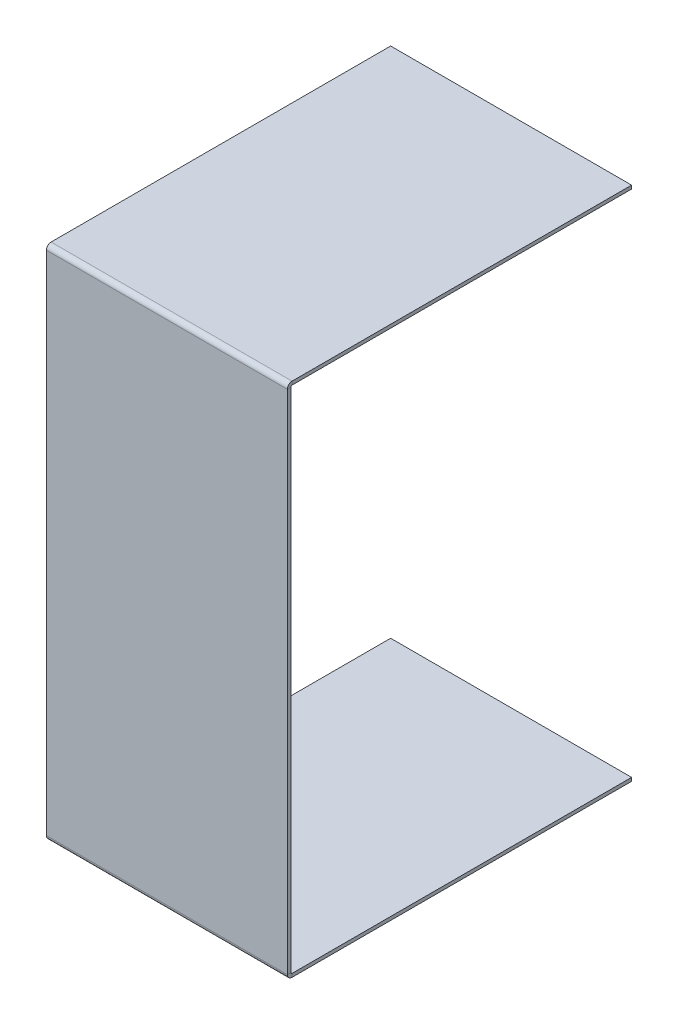
ISO-10303-21;
HEADER;
FILE_DESCRIPTION(('STEP AP214'),'2;1');
FILE_NAME('part.step','',(''),(''),'','','');
FILE_SCHEMA(('AUTOMOTIVE_DESIGN { 1 0 10303 214 1 1 1 1 }'));
ENDSEC;
DATA;
#1=APPLICATION_CONTEXT('core data for automotive mechanical design processes');
#2=APPLICATION_PROTOCOL_DEFINITION('international standard','automotive_design',2000,#1);
#3=PRODUCT_CONTEXT('',#1,'mechanical');
#4=PRODUCT('Part','Part','',(#3));
#5=PRODUCT_RELATED_PRODUCT_CATEGORY('part','',(#4));
#6=PRODUCT_DEFINITION_FORMATION('','',#4);
#7=PRODUCT_DEFINITION_CONTEXT('part definition',#1,'design');
#8=PRODUCT_DEFINITION('design','',#6,#7);
#9=PRODUCT_DEFINITION_SHAPE('','',#8);
#10=(LENGTH_UNIT() NAMED_UNIT(*) SI_UNIT(.MILLI.,.METRE.));
#11=(NAMED_UNIT(*) PLANE_ANGLE_UNIT() SI_UNIT($,.RADIAN.));
#12=(NAMED_UNIT(*) SI_UNIT($,.STERADIAN.) SOLID_ANGLE_UNIT());
#13=UNCERTAINTY_MEASURE_WITH_UNIT(LENGTH_MEASURE(1.E-05),#10,'distance_accuracy_value','');
#14=(GEOMETRIC_REPRESENTATION_CONTEXT(3) GLOBAL_UNCERTAINTY_ASSIGNED_CONTEXT((#13)) GLOBAL_UNIT_ASSIGNED_CONTEXT((#10,
#11,#12)) REPRESENTATION_CONTEXT('',''));
#15=CARTESIAN_POINT('',(0.,0.,0.));
#16=DIRECTION('',(0.,0.,1.));
#17=DIRECTION('',(1.,0.,0.));
#18=AXIS2_PLACEMENT_3D('',#15,#16,#17);
#19=CARTESIAN_POINT('',(0.,0.,-2.));
#20=DIRECTION('',(0.,0.,1.));
#21=DIRECTION('',(1.,0.,0.));
#22=AXIS2_PLACEMENT_3D('',#19,#20,#21);
#23=PLANE('',#22);
#24=DIRECTION('',(-1.,0.,0.));
#25=VECTOR('',#24,1.);
#26=CARTESIAN_POINT('',(-511.560693641619,-138.592879768786,-2.));
#27=LINE('',#26,#25);
#28=CARTESIAN_POINT('',(-511.560693641619,-138.592879768786,-2.));
#29=VERTEX_POINT('',#28);
#30=CARTESIAN_POINT('',(-371.560693641619,-138.592879768786,-2.));
#31=VERTEX_POINT('',#30);
#32=EDGE_CURVE('E320',#29,#31,#27,.F.);
#33=ORIENTED_EDGE('',*,*,#32,.F.);
#34=DIRECTION('',(0.,-1.,0.));
#35=VECTOR('',#34,1.);
#36=CARTESIAN_POINT('',(-511.560693641619,158.670520231214,-2.));
#37=LINE('',#36,#35);
#38=CARTESIAN_POINT('',(-511.560693641619,155.933920231214,-2.));
#39=VERTEX_POINT('',#38);
#40=EDGE_CURVE('E90',#39,#29,#37,.T.);
#41=ORIENTED_EDGE('',*,*,#40,.F.);
#42=DIRECTION('',(1.,0.,0.));
#43=VECTOR('',#42,1.);
#44=CARTESIAN_POINT('',(-371.560693641619,155.933920231214,-2.));
#45=LINE('',#44,#43);
#46=CARTESIAN_POINT('',(-371.560693641619,155.933920231214,-2.));
#47=VERTEX_POINT('',#46);
#48=EDGE_CURVE('E147',#47,#39,#45,.F.);
#49=ORIENTED_EDGE('',*,*,#48,.F.);
#50=DIRECTION('',(0.,1.,0.));
#51=VECTOR('',#50,1.);
#52=CARTESIAN_POINT('',(-371.560693641619,158.670520231214,-2.));
#53=LINE('',#52,#51);
#54=EDGE_CURVE('E13',#31,#47,#53,.T.);
#55=ORIENTED_EDGE('',*,*,#54,.F.);
#56=EDGE_LOOP('',(#33,#41,#49,#55));
#57=FACE_BOUND('',#56,.T.);
#58=ADVANCED_FACE('F81',(#57),#23,.F.);
#59=CARTESIAN_POINT('',(0.,0.,0.));
#60=DIRECTION('',(0.,0.,1.));
#61=DIRECTION('',(1.,0.,0.));
#62=AXIS2_PLACEMENT_3D('',#59,#60,#61);
#63=PLANE('',#62);
#64=DIRECTION('',(0.,-1.,0.));
#65=VECTOR('',#64,1.);
#66=CARTESIAN_POINT('',(-511.560693641619,158.670520231214,0.));
#67=LINE('',#66,#65);
#68=CARTESIAN_POINT('',(-511.560693641619,155.933920231214,0.));
#69=VERTEX_POINT('',#68);
#70=CARTESIAN_POINT('',(-511.560693641619,-138.592879768786,0.));
#71=VERTEX_POINT('',#70);
#72=EDGE_CURVE('E183',#69,#71,#67,.T.);
#73=ORIENTED_EDGE('',*,*,#72,.T.);
#74=DIRECTION('',(-1.,0.,0.));
#75=VECTOR('',#74,1.);
#76=CARTESIAN_POINT('',(-511.560693641619,-138.592879768786,0.));
#77=LINE('',#76,#75);
#78=CARTESIAN_POINT('',(-371.560693641619,-138.592879768786,0.));
#79=VERTEX_POINT('',#78);
#80=EDGE_CURVE('E192',#71,#79,#77,.F.);
#81=ORIENTED_EDGE('',*,*,#80,.T.);
#82=DIRECTION('',(0.,1.,0.));
#83=VECTOR('',#82,1.);
#84=CARTESIAN_POINT('',(-371.560693641619,158.670520231214,0.));
#85=LINE('',#84,#83);
#86=CARTESIAN_POINT('',(-371.560693641619,155.933920231214,0.));
#87=VERTEX_POINT('',#86);
#88=EDGE_CURVE('E85',#79,#87,#85,.T.);
#89=ORIENTED_EDGE('',*,*,#88,.T.);
#90=DIRECTION('',(1.,0.,0.));
#91=VECTOR('',#90,1.);
#92=CARTESIAN_POINT('',(-371.560693641619,155.933920231214,0.));
#93=LINE('',#92,#91);
#94=EDGE_CURVE('E174',#87,#69,#93,.F.);
#95=ORIENTED_EDGE('',*,*,#94,.T.);
#96=EDGE_LOOP('',(#73,#81,#89,#95));
#97=FACE_BOUND('',#96,.T.);
#98=ADVANCED_FACE('F189',(#97),#63,.T.);
#99=CARTESIAN_POINT('',(-511.560693641619,158.670520231214,-2.));
#100=DIRECTION('',(-1.,0.,0.));
#101=DIRECTION('',(0.,0.,1.));
#102=AXIS2_PLACEMENT_3D('',#99,#100,#101);
#103=PLANE('',#102);
#104=ORIENTED_EDGE('',*,*,#40,.T.);
#105=DIRECTION('',(0.,0.,1.));
#106=VECTOR('',#105,1.);
#107=CARTESIAN_POINT('',(-511.560693641619,-138.592879768786,-2.));
#108=LINE('',#107,#106);
#109=EDGE_CURVE('E200',#29,#71,#108,.T.);
#110=ORIENTED_EDGE('',*,*,#109,.T.);
#111=ORIENTED_EDGE('',*,*,#72,.F.);
#112=DIRECTION('',(0.,0.,1.));
#113=VECTOR('',#112,1.);
#114=CARTESIAN_POINT('',(-511.560693641619,155.933920231214,-2.));
#115=LINE('',#114,#113);
#116=EDGE_CURVE('E181',#39,#69,#115,.T.);
#117=ORIENTED_EDGE('',*,*,#116,.F.);
#118=EDGE_LOOP('',(#104,#110,#111,#117));
#119=FACE_BOUND('',#118,.T.);
#120=ADVANCED_FACE('F83',(#119),#103,.T.);
#121=CARTESIAN_POINT('',(-371.560693641619,158.670520231214,-2.));
#122=DIRECTION('',(1.,0.,0.));
#123=DIRECTION('',(0.,0.,-1.));
#124=AXIS2_PLACEMENT_3D('',#121,#122,#123);
#125=PLANE('',#124);
#126=DIRECTION('',(0.,0.,1.));
#127=VECTOR('',#126,1.);
#128=CARTESIAN_POINT('',(-371.560693641619,-138.592879768786,-2.));
#129=LINE('',#128,#127);
#130=EDGE_CURVE('E173',#31,#79,#129,.T.);
#131=ORIENTED_EDGE('',*,*,#130,.F.);
#132=ORIENTED_EDGE('',*,*,#54,.T.);
#133=DIRECTION('',(0.,0.,1.));
#134=VECTOR('',#133,1.);
#135=CARTESIAN_POINT('',(-371.560693641619,155.933920231214,-2.));
#136=LINE('',#135,#134);
#137=EDGE_CURVE('E146',#47,#87,#136,.T.);
#138=ORIENTED_EDGE('',*,*,#137,.T.);
#139=ORIENTED_EDGE('',*,*,#88,.F.);
#140=EDGE_LOOP('',(#131,#132,#138,#139));
#141=FACE_BOUND('',#140,.T.);
#142=ADVANCED_FACE('F341',(#141),#125,.T.);
#143=CARTESIAN_POINT('',(-511.560693641619,155.933920231214,-2.73660000000001));
#144=DIRECTION('',(-1.,0.,0.));
#145=DIRECTION('',(0.,0.,1.));
#146=AXIS2_PLACEMENT_3D('',#143,#144,#145);
#147=PLANE('',#146);
#148=DIRECTION('',(0.,1.,0.));
#149=VECTOR('',#148,1.);
#150=CARTESIAN_POINT('',(-511.560693641619,158.670520231214,-2.73660000000001));
#151=LINE('',#150,#149);
#152=CARTESIAN_POINT('',(-511.560693641619,156.670520231214,-2.73660000000001));
#153=VERTEX_POINT('',#152);
#154=CARTESIAN_POINT('',(-511.560693641619,158.670520231214,-2.7366));
#155=VERTEX_POINT('',#154);
#156=EDGE_CURVE('E136',#153,#155,#151,.T.);
#157=ORIENTED_EDGE('',*,*,#156,.F.);
#158=CARTESIAN_POINT('',(-511.560693641619,155.933920231214,-2.73660000000001));
#159=DIRECTION('',(1.,0.,0.));
#160=DIRECTION('',(0.,0.,-1.));
#161=AXIS2_PLACEMENT_3D('',#158,#159,#160);
#162=CIRCLE('',#161,0.736600000000004);
#163=EDGE_CURVE('E130',#39,#153,#162,.F.);
#164=ORIENTED_EDGE('',*,*,#163,.F.);
#165=ORIENTED_EDGE('',*,*,#116,.T.);
#166=CARTESIAN_POINT('',(-511.560693641619,155.933920231214,-2.73660000000001));
#167=DIRECTION('',(1.,0.,0.));
#168=DIRECTION('',(0.,0.,-1.));
#169=AXIS2_PLACEMENT_3D('',#166,#167,#168);
#170=CIRCLE('',#169,2.7366);
#171=EDGE_CURVE('E98',#69,#155,#170,.F.);
#172=ORIENTED_EDGE('',*,*,#171,.T.);
#173=EDGE_LOOP('',(#157,#164,#165,#172));
#174=FACE_BOUND('',#173,.T.);
#175=ADVANCED_FACE('F344',(#174),#147,.T.);
#176=CARTESIAN_POINT('',(-371.560693641619,155.933920231214,-2.73660000000001));
#177=DIRECTION('',(-1.,0.,0.));
#178=DIRECTION('',(0.,0.,1.));
#179=AXIS2_PLACEMENT_3D('',#176,#177,#178);
#180=PLANE('',#179);
#181=CARTESIAN_POINT('',(-371.560693641619,155.933920231214,-2.73660000000001));
#182=DIRECTION('',(1.,0.,0.));
#183=DIRECTION('',(0.,0.,-1.));
#184=AXIS2_PLACEMENT_3D('',#181,#182,#183);
#185=CIRCLE('',#184,0.736600000000004);
#186=CARTESIAN_POINT('',(-371.560693641619,156.670520231214,-2.73660000000001));
#187=VERTEX_POINT('',#186);
#188=EDGE_CURVE('E127',#187,#47,#185,.T.);
#189=ORIENTED_EDGE('',*,*,#188,.F.);
#190=DIRECTION('',(0.,1.,0.));
#191=VECTOR('',#190,1.);
#192=CARTESIAN_POINT('',(-371.560693641619,156.670520231214,-2.73660000000001));
#193=LINE('',#192,#191);
#194=CARTESIAN_POINT('',(-371.560693641619,158.670520231214,-2.7366));
#195=VERTEX_POINT('',#194);
#196=EDGE_CURVE('E135',#187,#195,#193,.T.);
#197=ORIENTED_EDGE('',*,*,#196,.T.);
#198=CARTESIAN_POINT('',(-371.560693641619,155.933920231214,-2.73660000000001));
#199=DIRECTION('',(1.,0.,0.));
#200=DIRECTION('',(0.,0.,-1.));
#201=AXIS2_PLACEMENT_3D('',#198,#199,#200);
#202=CIRCLE('',#201,2.7366);
#203=EDGE_CURVE('E176',#195,#87,#202,.T.);
#204=ORIENTED_EDGE('',*,*,#203,.T.);
#205=ORIENTED_EDGE('',*,*,#137,.F.);
#206=EDGE_LOOP('',(#189,#197,#204,#205));
#207=FACE_BOUND('',#206,.T.);
#208=ADVANCED_FACE('F141',(#207),#180,.F.);
#209=CARTESIAN_POINT('',(-371.560693641619,155.933920231214,-2.73660000000001));
#210=DIRECTION('',(1.,0.,0.));
#211=DIRECTION('',(0.,1.,0.));
#212=AXIS2_PLACEMENT_3D('',#209,#210,#211);
#213=CYLINDRICAL_SURFACE('',#212,2.7366);
#214=ORIENTED_EDGE('',*,*,#94,.F.);
#215=ORIENTED_EDGE('',*,*,#203,.F.);
#216=DIRECTION('',(1.,0.,0.));
#217=VECTOR('',#216,1.);
#218=CARTESIAN_POINT('',(0.,158.670520231214,-2.7366));
#219=LINE('',#218,#217);
#220=EDGE_CURVE('E165',#155,#195,#219,.T.);
#221=ORIENTED_EDGE('',*,*,#220,.F.);
#222=ORIENTED_EDGE('',*,*,#171,.F.);
#223=EDGE_LOOP('',(#214,#215,#221,#222));
#224=FACE_BOUND('',#223,.T.);
#225=ADVANCED_FACE('F347',(#224),#213,.T.);
#226=CARTESIAN_POINT('',(-371.560693641619,155.933920231214,-2.73660000000001));
#227=DIRECTION('',(1.,0.,0.));
#228=DIRECTION('',(0.,1.,0.));
#229=AXIS2_PLACEMENT_3D('',#226,#227,#228);
#230=CYLINDRICAL_SURFACE('',#229,0.736600000000004);
#231=ORIENTED_EDGE('',*,*,#48,.T.);
#232=ORIENTED_EDGE('',*,*,#163,.T.);
#233=DIRECTION('',(-1.,0.,0.));
#234=VECTOR('',#233,1.);
#235=CARTESIAN_POINT('',(-511.560693641619,156.670520231214,-2.73660000000001));
#236=LINE('',#235,#234);
#237=EDGE_CURVE('E124',#153,#187,#236,.F.);
#238=ORIENTED_EDGE('',*,*,#237,.T.);
#239=ORIENTED_EDGE('',*,*,#188,.T.);
#240=EDGE_LOOP('',(#231,#232,#238,#239));
#241=FACE_BOUND('',#240,.T.);
#242=ADVANCED_FACE('F126',(#241),#230,.F.);
#243=CARTESIAN_POINT('',(-371.560693641619,158.670520231214,-1.99999999999999));
#244=DIRECTION('',(1.,0.,0.));
#245=DIRECTION('',(0.,0.,-1.));
#246=AXIS2_PLACEMENT_3D('',#243,#244,#245);
#247=PLANE('',#246);
#248=DIRECTION('',(0.,0.,1.));
#249=VECTOR('',#248,1.);
#250=CARTESIAN_POINT('',(-371.560693641619,158.670520231214,-1.99999999999999));
#251=LINE('',#250,#249);
#252=CARTESIAN_POINT('',(-371.560693641619,158.670520231215,-200.));
#253=VERTEX_POINT('',#252);
#254=EDGE_CURVE('E164',#253,#195,#251,.T.);
#255=ORIENTED_EDGE('',*,*,#254,.T.);
#256=ORIENTED_EDGE('',*,*,#196,.F.);
#257=DIRECTION('',(0.,0.,-1.));
#258=VECTOR('',#257,1.);
#259=CARTESIAN_POINT('',(-371.560693641619,156.670520231214,5.56059548263717E-13));
#260=LINE('',#259,#258);
#261=CARTESIAN_POINT('',(-371.560693641619,156.670520231215,-200.));
#262=VERTEX_POINT('',#261);
#263=EDGE_CURVE('E152',#262,#187,#260,.F.);
#264=ORIENTED_EDGE('',*,*,#263,.F.);
#265=DIRECTION('',(0.,-1.,0.));
#266=VECTOR('',#265,1.);
#267=CARTESIAN_POINT('',(-371.560693641619,158.670520231215,-200.));
#268=LINE('',#267,#266);
#269=EDGE_CURVE('E148',#253,#262,#268,.T.);
#270=ORIENTED_EDGE('',*,*,#269,.F.);
#271=EDGE_LOOP('',(#255,#256,#264,#270));
#272=FACE_BOUND('',#271,.T.);
#273=ADVANCED_FACE('F162',(#272),#247,.T.);
#274=CARTESIAN_POINT('',(-511.560693641619,158.670520231215,-200.));
#275=DIRECTION('',(-1.,0.,0.));
#276=DIRECTION('',(0.,0.,1.));
#277=AXIS2_PLACEMENT_3D('',#274,#275,#276);
#278=PLANE('',#277);
#279=DIRECTION('',(0.,0.,1.));
#280=VECTOR('',#279,1.);
#281=CARTESIAN_POINT('',(-511.560693641619,156.670520231214,5.56059548263717E-13));
#282=LINE('',#281,#280);
#283=CARTESIAN_POINT('',(-511.560693641619,156.670520231215,-200.));
#284=VERTEX_POINT('',#283);
#285=EDGE_CURVE('E167',#153,#284,#282,.F.);
#286=ORIENTED_EDGE('',*,*,#285,.F.);
#287=ORIENTED_EDGE('',*,*,#156,.T.);
#288=DIRECTION('',(0.,0.,-1.));
#289=VECTOR('',#288,1.);
#290=CARTESIAN_POINT('',(-511.560693641619,158.670520231215,-200.));
#291=LINE('',#290,#289);
#292=CARTESIAN_POINT('',(-511.560693641619,158.670520231215,-200.));
#293=VERTEX_POINT('',#292);
#294=EDGE_CURVE('E159',#155,#293,#291,.T.);
#295=ORIENTED_EDGE('',*,*,#294,.T.);
#296=DIRECTION('',(0.,-1.,0.));
#297=VECTOR('',#296,1.);
#298=CARTESIAN_POINT('',(-511.560693641619,158.670520231215,-200.));
#299=LINE('',#298,#297);
#300=EDGE_CURVE('E216',#293,#284,#299,.T.);
#301=ORIENTED_EDGE('',*,*,#300,.T.);
#302=EDGE_LOOP('',(#286,#287,#295,#301));
#303=FACE_BOUND('',#302,.T.);
#304=ADVANCED_FACE('F228',(#303),#278,.T.);
#305=CARTESIAN_POINT('',(0.,158.670520231214,5.63042510941403E-13));
#306=DIRECTION('',(0.,1.,0.));
#307=DIRECTION('',(0.,0.,1.));
#308=AXIS2_PLACEMENT_3D('',#305,#306,#307);
#309=PLANE('',#308);
#310=ORIENTED_EDGE('',*,*,#294,.F.);
#311=ORIENTED_EDGE('',*,*,#220,.T.);
#312=ORIENTED_EDGE('',*,*,#254,.F.);
#313=DIRECTION('',(1.,0.,0.));
#314=VECTOR('',#313,1.);
#315=CARTESIAN_POINT('',(-371.560693641619,158.670520231215,-200.));
#316=LINE('',#315,#314);
#317=EDGE_CURVE('E220',#293,#253,#316,.T.);
#318=ORIENTED_EDGE('',*,*,#317,.F.);
#319=EDGE_LOOP('',(#310,#311,#312,#318));
#320=FACE_BOUND('',#319,.T.);
#321=ADVANCED_FACE('F346',(#320),#309,.T.);
#322=CARTESIAN_POINT('',(0.,156.670520231214,5.56059548263717E-13));
#323=DIRECTION('',(0.,1.,0.));
#324=DIRECTION('',(0.,0.,1.));
#325=AXIS2_PLACEMENT_3D('',#322,#323,#324);
#326=PLANE('',#325);
#327=ORIENTED_EDGE('',*,*,#237,.F.);
#328=ORIENTED_EDGE('',*,*,#285,.T.);
#329=DIRECTION('',(-1.,0.,0.));
#330=VECTOR('',#329,1.);
#331=CARTESIAN_POINT('',(0.,156.670520231215,-200.));
#332=LINE('',#331,#330);
#333=EDGE_CURVE('E156',#284,#262,#332,.F.);
#334=ORIENTED_EDGE('',*,*,#333,.T.);
#335=ORIENTED_EDGE('',*,*,#263,.T.);
#336=EDGE_LOOP('',(#327,#328,#334,#335));
#337=FACE_BOUND('',#336,.T.);
#338=ADVANCED_FACE('F153',(#337),#326,.F.);
#339=CARTESIAN_POINT('',(-371.560693641619,158.670520231215,-200.));
#340=DIRECTION('',(0.,0.,-1.));
#341=DIRECTION('',(0.,1.,0.));
#342=AXIS2_PLACEMENT_3D('',#339,#340,#341);
#343=PLANE('',#342);
#344=ORIENTED_EDGE('',*,*,#333,.F.);
#345=ORIENTED_EDGE('',*,*,#300,.F.);
#346=ORIENTED_EDGE('',*,*,#317,.T.);
#347=ORIENTED_EDGE('',*,*,#269,.T.);
#348=EDGE_LOOP('',(#344,#345,#346,#347));
#349=FACE_BOUND('',#348,.T.);
#350=ADVANCED_FACE('F233',(#349),#343,.T.);
#351=CARTESIAN_POINT('',(-371.560693641619,-138.592879768786,-2.73660000000001));
#352=DIRECTION('',(1.,0.,0.));
#353=DIRECTION('',(0.,0.,-1.));
#354=AXIS2_PLACEMENT_3D('',#351,#352,#353);
#355=PLANE('',#354);
#356=DIRECTION('',(0.,1.,0.));
#357=VECTOR('',#356,1.);
#358=CARTESIAN_POINT('',(-371.560693641619,-141.329479768786,-2.7366));
#359=LINE('',#358,#357);
#360=CARTESIAN_POINT('',(-371.560693641619,-139.329479768786,-2.73660000000001));
#361=VERTEX_POINT('',#360);
#362=CARTESIAN_POINT('',(-371.560693641619,-141.329479768786,-2.7366));
#363=VERTEX_POINT('',#362);
#364=EDGE_CURVE('E296',#361,#363,#359,.F.);
#365=ORIENTED_EDGE('',*,*,#364,.F.);
#366=CARTESIAN_POINT('',(-371.560693641619,-138.592879768786,-2.73660000000001));
#367=DIRECTION('',(-1.,0.,0.));
#368=DIRECTION('',(0.,0.,1.));
#369=AXIS2_PLACEMENT_3D('',#366,#367,#368);
#370=CIRCLE('',#369,0.736600000000004);
#371=EDGE_CURVE('E317',#31,#361,#370,.F.);
#372=ORIENTED_EDGE('',*,*,#371,.F.);
#373=ORIENTED_EDGE('',*,*,#130,.T.);
#374=CARTESIAN_POINT('',(-371.560693641619,-138.592879768786,-2.73660000000001));
#375=DIRECTION('',(-1.,0.,0.));
#376=DIRECTION('',(0.,0.,1.));
#377=AXIS2_PLACEMENT_3D('',#374,#375,#376);
#378=CIRCLE('',#377,2.7366);
#379=EDGE_CURVE('E206',#79,#363,#378,.F.);
#380=ORIENTED_EDGE('',*,*,#379,.T.);
#381=EDGE_LOOP('',(#365,#372,#373,#380));
#382=FACE_BOUND('',#381,.T.);
#383=ADVANCED_FACE('F337',(#382),#355,.T.);
#384=CARTESIAN_POINT('',(-511.560693641619,-138.592879768786,-2.73660000000001));
#385=DIRECTION('',(1.,0.,0.));
#386=DIRECTION('',(0.,0.,-1.));
#387=AXIS2_PLACEMENT_3D('',#384,#385,#386);
#388=PLANE('',#387);
#389=CARTESIAN_POINT('',(-511.560693641619,-138.592879768786,-2.73660000000001));
#390=DIRECTION('',(-1.,0.,0.));
#391=DIRECTION('',(0.,0.,1.));
#392=AXIS2_PLACEMENT_3D('',#389,#390,#391);
#393=CIRCLE('',#392,0.736600000000004);
#394=CARTESIAN_POINT('',(-511.560693641619,-139.329479768786,-2.73660000000001));
#395=VERTEX_POINT('',#394);
#396=EDGE_CURVE('E321',#395,#29,#393,.T.);
#397=ORIENTED_EDGE('',*,*,#396,.F.);
#398=DIRECTION('',(0.,1.,0.));
#399=VECTOR('',#398,1.);
#400=CARTESIAN_POINT('',(-511.560693641619,-139.329479768786,-2.73660000000001));
#401=LINE('',#400,#399);
#402=CARTESIAN_POINT('',(-511.560693641619,-141.329479768786,-2.7366));
#403=VERTEX_POINT('',#402);
#404=EDGE_CURVE('E308',#395,#403,#401,.F.);
#405=ORIENTED_EDGE('',*,*,#404,.T.);
#406=CARTESIAN_POINT('',(-511.560693641619,-138.592879768786,-2.73660000000001));
#407=DIRECTION('',(-1.,0.,0.));
#408=DIRECTION('',(0.,0.,1.));
#409=AXIS2_PLACEMENT_3D('',#406,#407,#408);
#410=CIRCLE('',#409,2.7366);
#411=EDGE_CURVE('E314',#403,#71,#410,.T.);
#412=ORIENTED_EDGE('',*,*,#411,.T.);
#413=ORIENTED_EDGE('',*,*,#109,.F.);
#414=EDGE_LOOP('',(#397,#405,#412,#413));
#415=FACE_BOUND('',#414,.T.);
#416=ADVANCED_FACE('F333',(#415),#388,.F.);
#417=CARTESIAN_POINT('',(-511.560693641619,-138.592879768786,-2.73660000000001));
#418=DIRECTION('',(-1.,0.,0.));
#419=DIRECTION('',(0.,-1.,0.));
#420=AXIS2_PLACEMENT_3D('',#417,#418,#419);
#421=CYLINDRICAL_SURFACE('',#420,2.7366);
#422=ORIENTED_EDGE('',*,*,#80,.F.);
#423=ORIENTED_EDGE('',*,*,#411,.F.);
#424=DIRECTION('',(-1.,0.,0.));
#425=VECTOR('',#424,1.);
#426=CARTESIAN_POINT('',(-371.560693641619,-141.329479768786,-2.7366));
#427=LINE('',#426,#425);
#428=EDGE_CURVE('E306',#403,#363,#427,.F.);
#429=ORIENTED_EDGE('',*,*,#428,.T.);
#430=ORIENTED_EDGE('',*,*,#379,.F.);
#431=EDGE_LOOP('',(#422,#423,#429,#430));
#432=FACE_BOUND('',#431,.T.);
#433=ADVANCED_FACE('F335',(#432),#421,.T.);
#434=CARTESIAN_POINT('',(-511.560693641619,-138.592879768786,-2.73660000000001));
#435=DIRECTION('',(-1.,0.,0.));
#436=DIRECTION('',(0.,-1.,0.));
#437=AXIS2_PLACEMENT_3D('',#434,#435,#436);
#438=CYLINDRICAL_SURFACE('',#437,0.736600000000004);
#439=ORIENTED_EDGE('',*,*,#32,.T.);
#440=ORIENTED_EDGE('',*,*,#371,.T.);
#441=DIRECTION('',(-1.,0.,0.));
#442=VECTOR('',#441,1.);
#443=CARTESIAN_POINT('',(-371.560693641619,-139.329479768786,-2.73660000000001));
#444=LINE('',#443,#442);
#445=EDGE_CURVE('E311',#361,#395,#444,.T.);
#446=ORIENTED_EDGE('',*,*,#445,.T.);
#447=ORIENTED_EDGE('',*,*,#396,.T.);
#448=EDGE_LOOP('',(#439,#440,#446,#447));
#449=FACE_BOUND('',#448,.T.);
#450=ADVANCED_FACE('F331',(#449),#438,.F.);
#451=CARTESIAN_POINT('',(-511.560693641619,-141.329479768787,-200.));
#452=DIRECTION('',(1.,0.,0.));
#453=DIRECTION('',(0.,1.,0.));
#454=AXIS2_PLACEMENT_3D('',#451,#452,#453);
#455=PLANE('',#454);
#456=ORIENTED_EDGE('',*,*,#404,.F.);
#457=DIRECTION('',(0.,0.,1.));
#458=VECTOR('',#457,1.);
#459=CARTESIAN_POINT('',(-511.560693641619,-139.329479768787,-200.));
#460=LINE('',#459,#458);
#461=CARTESIAN_POINT('',(-511.560693641619,-139.329479768787,-200.));
#462=VERTEX_POINT('',#461);
#463=EDGE_CURVE('E304',#395,#462,#460,.F.);
#464=ORIENTED_EDGE('',*,*,#463,.T.);
#465=DIRECTION('',(0.,1.,0.));
#466=VECTOR('',#465,1.);
#467=CARTESIAN_POINT('',(-511.560693641619,-141.329479768787,-200.));
#468=LINE('',#467,#466);
#469=CARTESIAN_POINT('',(-511.560693641619,-141.329479768787,-200.));
#470=VERTEX_POINT('',#469);
#471=EDGE_CURVE('E292',#470,#462,#468,.T.);
#472=ORIENTED_EDGE('',*,*,#471,.F.);
#473=DIRECTION('',(0.,0.,-1.));
#474=VECTOR('',#473,1.);
#475=CARTESIAN_POINT('',(-511.560693641619,-141.329479768786,5.02270975612035E-13));
#476=LINE('',#475,#474);
#477=EDGE_CURVE('E279',#403,#470,#476,.T.);
#478=ORIENTED_EDGE('',*,*,#477,.F.);
#479=EDGE_LOOP('',(#456,#464,#472,#478));
#480=FACE_BOUND('',#479,.T.);
#481=ADVANCED_FACE('F326',(#480),#455,.F.);
#482=CARTESIAN_POINT('',(-371.560693641619,-141.329479768786,-1.99999999999999));
#483=DIRECTION('',(-1.,0.,0.));
#484=DIRECTION('',(0.,-1.,0.));
#485=AXIS2_PLACEMENT_3D('',#482,#483,#484);
#486=PLANE('',#485);
#487=ORIENTED_EDGE('',*,*,#364,.T.);
#488=DIRECTION('',(0.,0.,1.));
#489=VECTOR('',#488,1.);
#490=CARTESIAN_POINT('',(-371.560693641619,-141.329479768786,5.02270975612034E-13));
#491=LINE('',#490,#489);
#492=CARTESIAN_POINT('',(-371.560693641619,-141.329479768787,-200.));
#493=VERTEX_POINT('',#492);
#494=EDGE_CURVE('E277',#493,#363,#491,.T.);
#495=ORIENTED_EDGE('',*,*,#494,.F.);
#496=DIRECTION('',(0.,1.,0.));
#497=VECTOR('',#496,1.);
#498=CARTESIAN_POINT('',(-371.560693641619,-141.329479768787,-200.));
#499=LINE('',#498,#497);
#500=CARTESIAN_POINT('',(-371.560693641619,-139.329479768787,-200.));
#501=VERTEX_POINT('',#500);
#502=EDGE_CURVE('E285',#493,#501,#499,.T.);
#503=ORIENTED_EDGE('',*,*,#502,.T.);
#504=DIRECTION('',(0.,0.,-1.));
#505=VECTOR('',#504,1.);
#506=CARTESIAN_POINT('',(-371.560693641619,-139.329479768786,-2.));
#507=LINE('',#506,#505);
#508=EDGE_CURVE('E301',#501,#361,#507,.F.);
#509=ORIENTED_EDGE('',*,*,#508,.T.);
#510=EDGE_LOOP('',(#487,#495,#503,#509));
#511=FACE_BOUND('',#510,.T.);
#512=ADVANCED_FACE('F295',(#511),#486,.F.);
#513=CARTESIAN_POINT('',(0.,-141.329479768786,5.02270975612034E-13));
#514=DIRECTION('',(0.,1.,0.));
#515=DIRECTION('',(0.,0.,1.));
#516=AXIS2_PLACEMENT_3D('',#513,#514,#515);
#517=PLANE('',#516);
#518=ORIENTED_EDGE('',*,*,#428,.F.);
#519=ORIENTED_EDGE('',*,*,#477,.T.);
#520=DIRECTION('',(1.,0.,0.));
#521=VECTOR('',#520,1.);
#522=CARTESIAN_POINT('',(0.,-141.329479768787,-200.));
#523=LINE('',#522,#521);
#524=EDGE_CURVE('E272',#470,#493,#523,.T.);
#525=ORIENTED_EDGE('',*,*,#524,.T.);
#526=ORIENTED_EDGE('',*,*,#494,.T.);
#527=EDGE_LOOP('',(#518,#519,#525,#526));
#528=FACE_BOUND('',#527,.T.);
#529=ADVANCED_FACE('F275',(#528),#517,.F.);
#530=CARTESIAN_POINT('',(0.,-139.329479768786,4.95288012934348E-13));
#531=DIRECTION('',(0.,1.,0.));
#532=DIRECTION('',(0.,0.,1.));
#533=AXIS2_PLACEMENT_3D('',#530,#531,#532);
#534=PLANE('',#533);
#535=ORIENTED_EDGE('',*,*,#463,.F.);
#536=ORIENTED_EDGE('',*,*,#445,.F.);
#537=ORIENTED_EDGE('',*,*,#508,.F.);
#538=DIRECTION('',(-1.,0.,0.));
#539=VECTOR('',#538,1.);
#540=CARTESIAN_POINT('',(-371.560693641619,-139.329479768787,-200.));
#541=LINE('',#540,#539);
#542=EDGE_CURVE('E288',#462,#501,#541,.F.);
#543=ORIENTED_EDGE('',*,*,#542,.F.);
#544=EDGE_LOOP('',(#535,#536,#537,#543));
#545=FACE_BOUND('',#544,.T.);
#546=ADVANCED_FACE('F330',(#545),#534,.T.);
#547=CARTESIAN_POINT('',(-371.560693641619,-141.329479768787,-200.));
#548=DIRECTION('',(0.,0.,1.));
#549=DIRECTION('',(0.,-1.,0.));
#550=AXIS2_PLACEMENT_3D('',#547,#548,#549);
#551=PLANE('',#550);
#552=ORIENTED_EDGE('',*,*,#542,.T.);
#553=ORIENTED_EDGE('',*,*,#502,.F.);
#554=ORIENTED_EDGE('',*,*,#524,.F.);
#555=ORIENTED_EDGE('',*,*,#471,.T.);
#556=EDGE_LOOP('',(#552,#553,#554,#555));
#557=FACE_BOUND('',#556,.T.);
#558=ADVANCED_FACE('F286',(#557),#551,.F.);
#559=CLOSED_SHELL('',(#58,#98,#120,#142,#175,#208,#225,#242,#273,#304,#321,#338,#350,#383,#416,
#433,#450,#481,#512,#529,#546,#558));
#560=MANIFOLD_SOLID_BREP('B2',#559);
#561=ADVANCED_BREP_SHAPE_REPRESENTATION('',(#18,#560),#14);
#562=SHAPE_DEFINITION_REPRESENTATION(#9,#561);
ENDSEC;
END-ISO-10303-21;
